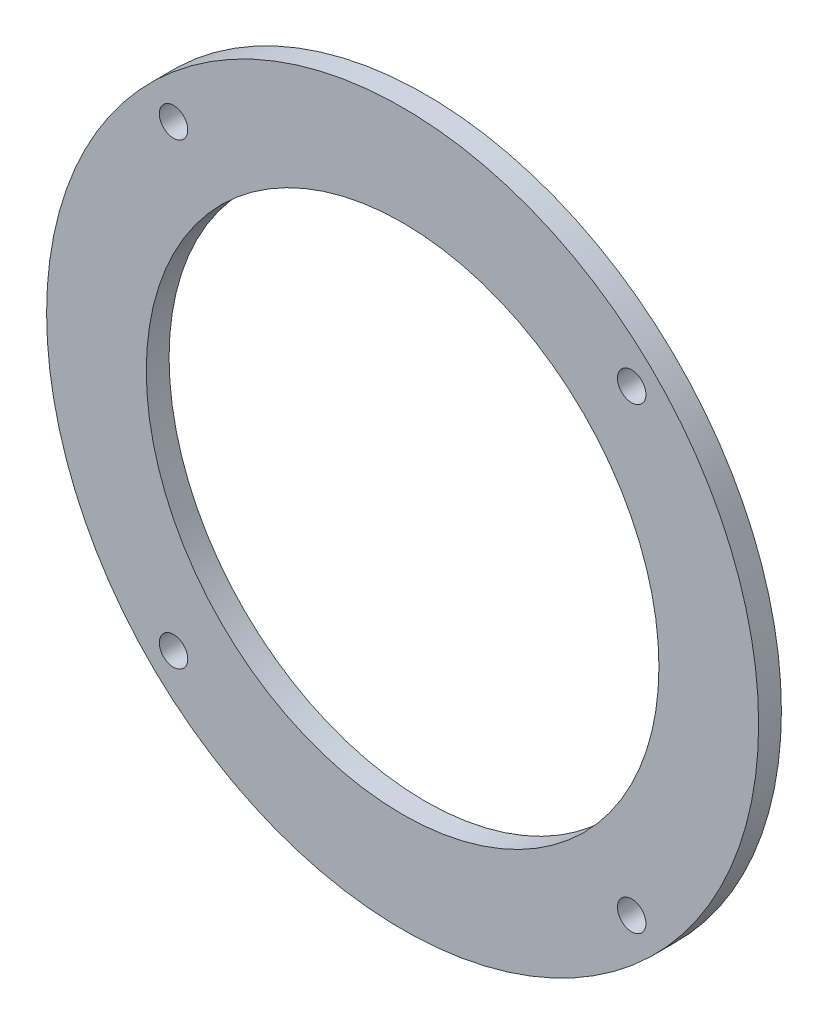
ISO-10303-21;
HEADER;
FILE_DESCRIPTION(('STEP AP214'),'2;1');
FILE_NAME('part.step','',(''),(''),'','','');
FILE_SCHEMA(('AUTOMOTIVE_DESIGN { 1 0 10303 214 1 1 1 1 }'));
ENDSEC;
DATA;
#1=APPLICATION_CONTEXT('core data for automotive mechanical design processes');
#2=APPLICATION_PROTOCOL_DEFINITION('international standard','automotive_design',2000,#1);
#3=PRODUCT_CONTEXT('',#1,'mechanical');
#4=PRODUCT('Part','Part','',(#3));
#5=PRODUCT_RELATED_PRODUCT_CATEGORY('part','',(#4));
#6=PRODUCT_DEFINITION_FORMATION('','',#4);
#7=PRODUCT_DEFINITION_CONTEXT('part definition',#1,'design');
#8=PRODUCT_DEFINITION('design','',#6,#7);
#9=PRODUCT_DEFINITION_SHAPE('','',#8);
#10=(LENGTH_UNIT() NAMED_UNIT(*) SI_UNIT(.MILLI.,.METRE.));
#11=(NAMED_UNIT(*) PLANE_ANGLE_UNIT() SI_UNIT($,.RADIAN.));
#12=(NAMED_UNIT(*) SI_UNIT($,.STERADIAN.) SOLID_ANGLE_UNIT());
#13=UNCERTAINTY_MEASURE_WITH_UNIT(LENGTH_MEASURE(1.E-05),#10,'distance_accuracy_value','');
#14=(GEOMETRIC_REPRESENTATION_CONTEXT(3) GLOBAL_UNCERTAINTY_ASSIGNED_CONTEXT((#13)) GLOBAL_UNIT_ASSIGNED_CONTEXT((#10,
#11,#12)) REPRESENTATION_CONTEXT('',''));
#15=CARTESIAN_POINT('',(0.,0.,0.));
#16=DIRECTION('',(0.,0.,1.));
#17=DIRECTION('',(1.,0.,0.));
#18=AXIS2_PLACEMENT_3D('',#15,#16,#17);
#19=CARTESIAN_POINT('',(0.,0.,1.6));
#20=DIRECTION('',(0.,0.,1.));
#21=DIRECTION('',(1.,0.,0.));
#22=AXIS2_PLACEMENT_3D('',#19,#20,#21);
#23=PLANE('',#22);
#24=CARTESIAN_POINT('',(-16.086679271994,16.086679271994,1.6));
#25=DIRECTION('',(0.,0.,1.));
#26=DIRECTION('',(1.,0.,0.));
#27=AXIS2_PLACEMENT_3D('',#24,#25,#26);
#28=CIRCLE('',#27,0.999999999999998);
#29=CARTESIAN_POINT('',(-15.086679271994,16.086679271994,1.6));
#30=VERTEX_POINT('',#29);
#31=EDGE_CURVE('E345',#30,#30,#28,.T.);
#32=ORIENTED_EDGE('',*,*,#31,.F.);
#33=EDGE_LOOP('',(#32));
#34=FACE_BOUND('',#33,.T.);
#35=CARTESIAN_POINT('',(-16.086679271994,-16.086679271994,1.6));
#36=DIRECTION('',(0.,0.,1.));
#37=DIRECTION('',(1.,0.,0.));
#38=AXIS2_PLACEMENT_3D('',#35,#36,#37);
#39=CIRCLE('',#38,0.999999999999998);
#40=CARTESIAN_POINT('',(-15.086679271994,-16.086679271994,1.6));
#41=VERTEX_POINT('',#40);
#42=EDGE_CURVE('E357',#41,#41,#39,.T.);
#43=ORIENTED_EDGE('',*,*,#42,.F.);
#44=EDGE_LOOP('',(#43));
#45=FACE_BOUND('',#44,.T.);
#46=CARTESIAN_POINT('',(0.,0.,1.6));
#47=DIRECTION('',(0.,0.,1.));
#48=DIRECTION('',(1.,0.,0.));
#49=AXIS2_PLACEMENT_3D('',#46,#47,#48);
#50=CIRCLE('',#49,25.);
#51=CARTESIAN_POINT('',(25.,0.,1.6));
#52=VERTEX_POINT('',#51);
#53=EDGE_CURVE('E12',#52,#52,#50,.T.);
#54=ORIENTED_EDGE('',*,*,#53,.T.);
#55=EDGE_LOOP('',(#54));
#56=FACE_BOUND('',#55,.T.);
#57=CARTESIAN_POINT('',(16.086679271994,-16.086679271994,1.6));
#58=DIRECTION('',(0.,0.,1.));
#59=DIRECTION('',(1.,0.,0.));
#60=AXIS2_PLACEMENT_3D('',#57,#58,#59);
#61=CIRCLE('',#60,0.999999999999998);
#62=CARTESIAN_POINT('',(17.086679271994,-16.086679271994,1.6));
#63=VERTEX_POINT('',#62);
#64=EDGE_CURVE('E363',#63,#63,#61,.T.);
#65=ORIENTED_EDGE('',*,*,#64,.F.);
#66=EDGE_LOOP('',(#65));
#67=FACE_BOUND('',#66,.T.);
#68=CARTESIAN_POINT('',(0.,0.,1.6));
#69=DIRECTION('',(0.,0.,1.));
#70=DIRECTION('',(1.,0.,0.));
#71=AXIS2_PLACEMENT_3D('',#68,#69,#70);
#72=CIRCLE('',#71,18.);
#73=CARTESIAN_POINT('',(18.,0.,1.6));
#74=VERTEX_POINT('',#73);
#75=EDGE_CURVE('E351',#74,#74,#72,.T.);
#76=ORIENTED_EDGE('',*,*,#75,.F.);
#77=EDGE_LOOP('',(#76));
#78=FACE_BOUND('',#77,.T.);
#79=CARTESIAN_POINT('',(16.086679271994,16.086679271994,1.6));
#80=DIRECTION('',(0.,0.,1.));
#81=DIRECTION('',(1.,0.,0.));
#82=AXIS2_PLACEMENT_3D('',#79,#80,#81);
#83=CIRCLE('',#82,0.999999999999998);
#84=CARTESIAN_POINT('',(17.086679271994,16.086679271994,1.6));
#85=VERTEX_POINT('',#84);
#86=EDGE_CURVE('E339',#85,#85,#83,.T.);
#87=ORIENTED_EDGE('',*,*,#86,.F.);
#88=EDGE_LOOP('',(#87));
#89=FACE_BOUND('',#88,.T.);
#90=ADVANCED_FACE('F89',(#34,#45,#56,#67,#78,#89),#23,.T.);
#91=CARTESIAN_POINT('',(0.,0.,0.));
#92=DIRECTION('',(0.,0.,1.));
#93=DIRECTION('',(1.,0.,0.));
#94=AXIS2_PLACEMENT_3D('',#91,#92,#93);
#95=PLANE('',#94);
#96=DIRECTION('',(-1.,0.,0.));
#97=VECTOR('',#96,1.);
#98=CARTESIAN_POINT('',(0.700000000000007,23.8,0.));
#99=LINE('',#98,#97);
#100=CARTESIAN_POINT('',(1.9,23.8,0.));
#101=VERTEX_POINT('',#100);
#102=CARTESIAN_POINT('',(0.700000000000007,23.8,0.));
#103=VERTEX_POINT('',#102);
#104=EDGE_CURVE('E227',#101,#103,#99,.T.);
#105=ORIENTED_EDGE('',*,*,#104,.T.);
#106=DIRECTION('',(0.,-1.,0.));
#107=VECTOR('',#106,1.);
#108=CARTESIAN_POINT('',(0.700000000000007,23.8,0.));
#109=LINE('',#108,#107);
#110=CARTESIAN_POINT('',(0.700000000000007,21.5,0.));
#111=VERTEX_POINT('',#110);
#112=EDGE_CURVE('E234',#103,#111,#109,.T.);
#113=ORIENTED_EDGE('',*,*,#112,.T.);
#114=DIRECTION('',(1.,0.,0.));
#115=VECTOR('',#114,1.);
#116=CARTESIAN_POINT('',(0.700000000000007,21.5,0.));
#117=LINE('',#116,#115);
#118=CARTESIAN_POINT('',(1.9,21.5,0.));
#119=VERTEX_POINT('',#118);
#120=EDGE_CURVE('E207',#111,#119,#117,.T.);
#121=ORIENTED_EDGE('',*,*,#120,.T.);
#122=DIRECTION('',(0.,1.,0.));
#123=VECTOR('',#122,1.);
#124=CARTESIAN_POINT('',(1.9,23.8,0.));
#125=LINE('',#124,#123);
#126=EDGE_CURVE('E104',#119,#101,#125,.T.);
#127=ORIENTED_EDGE('',*,*,#126,.T.);
#128=EDGE_LOOP('',(#105,#113,#121,#127));
#129=FACE_BOUND('',#128,.T.);
#130=DIRECTION('',(1.,0.,0.));
#131=VECTOR('',#130,1.);
#132=CARTESIAN_POINT('',(3.30000000000001,21.5,0.));
#133=LINE('',#132,#131);
#134=CARTESIAN_POINT('',(3.30000000000001,21.5,0.));
#135=VERTEX_POINT('',#134);
#136=CARTESIAN_POINT('',(4.49999999999995,21.5,0.));
#137=VERTEX_POINT('',#136);
#138=EDGE_CURVE('E247',#135,#137,#133,.T.);
#139=ORIENTED_EDGE('',*,*,#138,.T.);
#140=DIRECTION('',(0.,1.,0.));
#141=VECTOR('',#140,1.);
#142=CARTESIAN_POINT('',(4.49999999999995,23.8,0.));
#143=LINE('',#142,#141);
#144=CARTESIAN_POINT('',(4.49999999999995,23.8,0.));
#145=VERTEX_POINT('',#144);
#146=EDGE_CURVE('E239',#137,#145,#143,.T.);
#147=ORIENTED_EDGE('',*,*,#146,.T.);
#148=DIRECTION('',(-1.,0.,0.));
#149=VECTOR('',#148,1.);
#150=CARTESIAN_POINT('',(3.30000000000001,23.8,0.));
#151=LINE('',#150,#149);
#152=CARTESIAN_POINT('',(3.30000000000001,23.8,0.));
#153=VERTEX_POINT('',#152);
#154=EDGE_CURVE('E259',#145,#153,#151,.T.);
#155=ORIENTED_EDGE('',*,*,#154,.T.);
#156=DIRECTION('',(0.,-1.,0.));
#157=VECTOR('',#156,1.);
#158=CARTESIAN_POINT('',(3.30000000000001,23.8,0.));
#159=LINE('',#158,#157);
#160=EDGE_CURVE('E112',#153,#135,#159,.T.);
#161=ORIENTED_EDGE('',*,*,#160,.T.);
#162=EDGE_LOOP('',(#139,#147,#155,#161));
#163=FACE_BOUND('',#162,.T.);
#164=DIRECTION('',(0.,1.,0.));
#165=VECTOR('',#164,1.);
#166=CARTESIAN_POINT('',(-3.29999999999999,23.8,0.));
#167=LINE('',#166,#165);
#168=CARTESIAN_POINT('',(-3.29999999999999,21.5,0.));
#169=VERTEX_POINT('',#168);
#170=CARTESIAN_POINT('',(-3.29999999999999,23.8,0.));
#171=VERTEX_POINT('',#170);
#172=EDGE_CURVE('E277',#169,#171,#167,.T.);
#173=ORIENTED_EDGE('',*,*,#172,.T.);
#174=DIRECTION('',(-1.,0.,0.));
#175=VECTOR('',#174,1.);
#176=CARTESIAN_POINT('',(-3.29999999999999,23.8,0.));
#177=LINE('',#176,#175);
#178=CARTESIAN_POINT('',(-4.49999999999994,23.8,0.));
#179=VERTEX_POINT('',#178);
#180=EDGE_CURVE('E267',#171,#179,#177,.T.);
#181=ORIENTED_EDGE('',*,*,#180,.T.);
#182=DIRECTION('',(0.,-1.,0.));
#183=VECTOR('',#182,1.);
#184=CARTESIAN_POINT('',(-4.49999999999994,23.8,0.));
#185=LINE('',#184,#183);
#186=CARTESIAN_POINT('',(-4.49999999999994,21.5,0.));
#187=VERTEX_POINT('',#186);
#188=EDGE_CURVE('E289',#179,#187,#185,.T.);
#189=ORIENTED_EDGE('',*,*,#188,.T.);
#190=DIRECTION('',(1.,0.,0.));
#191=VECTOR('',#190,1.);
#192=CARTESIAN_POINT('',(-3.29999999999999,21.5,0.));
#193=LINE('',#192,#191);
#194=EDGE_CURVE('E292',#187,#169,#193,.T.);
#195=ORIENTED_EDGE('',*,*,#194,.T.);
#196=EDGE_LOOP('',(#173,#181,#189,#195));
#197=FACE_BOUND('',#196,.T.);
#198=DIRECTION('',(0.,1.,0.));
#199=VECTOR('',#198,1.);
#200=CARTESIAN_POINT('',(-0.699999999999995,23.8,0.));
#201=LINE('',#200,#199);
#202=CARTESIAN_POINT('',(-0.699999999999996,21.5,0.));
#203=VERTEX_POINT('',#202);
#204=CARTESIAN_POINT('',(-0.699999999999995,23.8,0.));
#205=VERTEX_POINT('',#204);
#206=EDGE_CURVE('E310',#203,#205,#201,.T.);
#207=ORIENTED_EDGE('',*,*,#206,.T.);
#208=DIRECTION('',(-1.,0.,0.));
#209=VECTOR('',#208,1.);
#210=CARTESIAN_POINT('',(-0.699999999999995,23.8,0.));
#211=LINE('',#210,#209);
#212=CARTESIAN_POINT('',(-1.89999999999999,23.8,0.));
#213=VERTEX_POINT('',#212);
#214=EDGE_CURVE('E299',#205,#213,#211,.T.);
#215=ORIENTED_EDGE('',*,*,#214,.T.);
#216=DIRECTION('',(0.,-1.,0.));
#217=VECTOR('',#216,1.);
#218=CARTESIAN_POINT('',(-1.89999999999999,23.8,0.));
#219=LINE('',#218,#217);
#220=CARTESIAN_POINT('',(-1.89999999999999,21.5,0.));
#221=VERTEX_POINT('',#220);
#222=EDGE_CURVE('E322',#213,#221,#219,.T.);
#223=ORIENTED_EDGE('',*,*,#222,.T.);
#224=DIRECTION('',(1.,0.,0.));
#225=VECTOR('',#224,1.);
#226=CARTESIAN_POINT('',(-0.699999999999996,21.5,0.));
#227=LINE('',#226,#225);
#228=EDGE_CURVE('E325',#221,#203,#227,.T.);
#229=ORIENTED_EDGE('',*,*,#228,.T.);
#230=EDGE_LOOP('',(#207,#215,#223,#229));
#231=FACE_BOUND('',#230,.T.);
#232=CARTESIAN_POINT('',(0.,0.,0.));
#233=DIRECTION('',(0.,0.,1.));
#234=DIRECTION('',(1.,0.,0.));
#235=AXIS2_PLACEMENT_3D('',#232,#233,#234);
#236=CIRCLE('',#235,25.);
#237=CARTESIAN_POINT('',(25.,0.,0.));
#238=VERTEX_POINT('',#237);
#239=EDGE_CURVE('E93',#238,#238,#236,.T.);
#240=ORIENTED_EDGE('',*,*,#239,.F.);
#241=EDGE_LOOP('',(#240));
#242=FACE_BOUND('',#241,.T.);
#243=CARTESIAN_POINT('',(16.086679271994,-16.086679271994,0.));
#244=DIRECTION('',(0.,0.,1.));
#245=DIRECTION('',(1.,0.,0.));
#246=AXIS2_PLACEMENT_3D('',#243,#244,#245);
#247=CIRCLE('',#246,0.999999999999998);
#248=CARTESIAN_POINT('',(17.086679271994,-16.086679271994,0.));
#249=VERTEX_POINT('',#248);
#250=EDGE_CURVE('E360',#249,#249,#247,.T.);
#251=ORIENTED_EDGE('',*,*,#250,.T.);
#252=EDGE_LOOP('',(#251));
#253=FACE_BOUND('',#252,.T.);
#254=CARTESIAN_POINT('',(-16.086679271994,-16.086679271994,0.));
#255=DIRECTION('',(0.,0.,1.));
#256=DIRECTION('',(1.,0.,0.));
#257=AXIS2_PLACEMENT_3D('',#254,#255,#256);
#258=CIRCLE('',#257,0.999999999999998);
#259=CARTESIAN_POINT('',(-15.086679271994,-16.086679271994,0.));
#260=VERTEX_POINT('',#259);
#261=EDGE_CURVE('E354',#260,#260,#258,.T.);
#262=ORIENTED_EDGE('',*,*,#261,.T.);
#263=EDGE_LOOP('',(#262));
#264=FACE_BOUND('',#263,.T.);
#265=CARTESIAN_POINT('',(0.,0.,0.));
#266=DIRECTION('',(0.,0.,1.));
#267=DIRECTION('',(1.,0.,0.));
#268=AXIS2_PLACEMENT_3D('',#265,#266,#267);
#269=CIRCLE('',#268,18.);
#270=CARTESIAN_POINT('',(18.,0.,0.));
#271=VERTEX_POINT('',#270);
#272=EDGE_CURVE('E348',#271,#271,#269,.T.);
#273=ORIENTED_EDGE('',*,*,#272,.T.);
#274=EDGE_LOOP('',(#273));
#275=FACE_BOUND('',#274,.T.);
#276=CARTESIAN_POINT('',(-16.086679271994,16.086679271994,0.));
#277=DIRECTION('',(0.,0.,1.));
#278=DIRECTION('',(1.,0.,0.));
#279=AXIS2_PLACEMENT_3D('',#276,#277,#278);
#280=CIRCLE('',#279,0.999999999999998);
#281=CARTESIAN_POINT('',(-15.086679271994,16.086679271994,0.));
#282=VERTEX_POINT('',#281);
#283=EDGE_CURVE('E342',#282,#282,#280,.T.);
#284=ORIENTED_EDGE('',*,*,#283,.T.);
#285=EDGE_LOOP('',(#284));
#286=FACE_BOUND('',#285,.T.);
#287=CARTESIAN_POINT('',(16.086679271994,16.086679271994,0.));
#288=DIRECTION('',(0.,0.,1.));
#289=DIRECTION('',(1.,0.,0.));
#290=AXIS2_PLACEMENT_3D('',#287,#288,#289);
#291=CIRCLE('',#290,0.999999999999998);
#292=CARTESIAN_POINT('',(17.086679271994,16.086679271994,0.));
#293=VERTEX_POINT('',#292);
#294=EDGE_CURVE('E332',#293,#293,#291,.T.);
#295=ORIENTED_EDGE('',*,*,#294,.T.);
#296=EDGE_LOOP('',(#295));
#297=FACE_BOUND('',#296,.T.);
#298=ADVANCED_FACE('F369',(#129,#163,#197,#231,#242,#253,#264,#275,#286,#297),#95,.F.);
#299=CARTESIAN_POINT('',(0.,0.,1.6));
#300=DIRECTION('',(0.,0.,-1.));
#301=DIRECTION('',(-1.,0.,0.));
#302=AXIS2_PLACEMENT_3D('',#299,#300,#301);
#303=CYLINDRICAL_SURFACE('',#302,25.);
#304=ORIENTED_EDGE('',*,*,#53,.F.);
#305=EDGE_LOOP('',(#304));
#306=FACE_BOUND('',#305,.T.);
#307=ORIENTED_EDGE('',*,*,#239,.T.);
#308=EDGE_LOOP('',(#307));
#309=FACE_BOUND('',#308,.T.);
#310=ADVANCED_FACE('F91',(#306,#309),#303,.T.);
#311=CARTESIAN_POINT('',(16.086679271994,-16.086679271994,1.6));
#312=DIRECTION('',(0.,0.,-1.));
#313=DIRECTION('',(-1.,0.,0.));
#314=AXIS2_PLACEMENT_3D('',#311,#312,#313);
#315=CYLINDRICAL_SURFACE('',#314,0.999999999999998);
#316=ORIENTED_EDGE('',*,*,#64,.T.);
#317=EDGE_LOOP('',(#316));
#318=FACE_BOUND('',#317,.T.);
#319=ORIENTED_EDGE('',*,*,#250,.F.);
#320=EDGE_LOOP('',(#319));
#321=FACE_BOUND('',#320,.T.);
#322=ADVANCED_FACE('F372',(#318,#321),#315,.F.);
#323=CARTESIAN_POINT('',(-16.086679271994,-16.086679271994,1.6));
#324=DIRECTION('',(0.,0.,-1.));
#325=DIRECTION('',(-1.,0.,0.));
#326=AXIS2_PLACEMENT_3D('',#323,#324,#325);
#327=CYLINDRICAL_SURFACE('',#326,0.999999999999998);
#328=ORIENTED_EDGE('',*,*,#42,.T.);
#329=EDGE_LOOP('',(#328));
#330=FACE_BOUND('',#329,.T.);
#331=ORIENTED_EDGE('',*,*,#261,.F.);
#332=EDGE_LOOP('',(#331));
#333=FACE_BOUND('',#332,.T.);
#334=ADVANCED_FACE('F374',(#330,#333),#327,.F.);
#335=CARTESIAN_POINT('',(0.,0.,1.6));
#336=DIRECTION('',(0.,0.,-1.));
#337=DIRECTION('',(-1.,0.,0.));
#338=AXIS2_PLACEMENT_3D('',#335,#336,#337);
#339=CYLINDRICAL_SURFACE('',#338,18.);
#340=ORIENTED_EDGE('',*,*,#75,.T.);
#341=EDGE_LOOP('',(#340));
#342=FACE_BOUND('',#341,.T.);
#343=ORIENTED_EDGE('',*,*,#272,.F.);
#344=EDGE_LOOP('',(#343));
#345=FACE_BOUND('',#344,.T.);
#346=ADVANCED_FACE('F381',(#342,#345),#339,.F.);
#347=CARTESIAN_POINT('',(-16.086679271994,16.086679271994,1.6));
#348=DIRECTION('',(0.,0.,-1.));
#349=DIRECTION('',(-1.,0.,0.));
#350=AXIS2_PLACEMENT_3D('',#347,#348,#349);
#351=CYLINDRICAL_SURFACE('',#350,0.999999999999998);
#352=ORIENTED_EDGE('',*,*,#31,.T.);
#353=EDGE_LOOP('',(#352));
#354=FACE_BOUND('',#353,.T.);
#355=ORIENTED_EDGE('',*,*,#283,.F.);
#356=EDGE_LOOP('',(#355));
#357=FACE_BOUND('',#356,.T.);
#358=ADVANCED_FACE('F408',(#354,#357),#351,.F.);
#359=CARTESIAN_POINT('',(16.086679271994,16.086679271994,1.6));
#360=DIRECTION('',(0.,0.,-1.));
#361=DIRECTION('',(-1.,0.,0.));
#362=AXIS2_PLACEMENT_3D('',#359,#360,#361);
#363=CYLINDRICAL_SURFACE('',#362,0.999999999999998);
#364=ORIENTED_EDGE('',*,*,#86,.T.);
#365=EDGE_LOOP('',(#364));
#366=FACE_BOUND('',#365,.T.);
#367=ORIENTED_EDGE('',*,*,#294,.F.);
#368=EDGE_LOOP('',(#367));
#369=FACE_BOUND('',#368,.T.);
#370=ADVANCED_FACE('F404',(#366,#369),#363,.F.);
#371=CARTESIAN_POINT('',(-0.699999999999995,23.8,-0.1));
#372=DIRECTION('',(0.,1.,0.));
#373=DIRECTION('',(0.,0.,1.));
#374=AXIS2_PLACEMENT_3D('',#371,#372,#373);
#375=PLANE('',#374);
#376=ORIENTED_EDGE('',*,*,#214,.F.);
#377=DIRECTION('',(0.,0.,1.));
#378=VECTOR('',#377,1.);
#379=CARTESIAN_POINT('',(-0.699999999999995,23.8,-0.1));
#380=LINE('',#379,#378);
#381=CARTESIAN_POINT('',(-0.699999999999995,23.8,-0.1));
#382=VERTEX_POINT('',#381);
#383=EDGE_CURVE('E330',#382,#205,#380,.T.);
#384=ORIENTED_EDGE('',*,*,#383,.F.);
#385=DIRECTION('',(-1.,0.,0.));
#386=VECTOR('',#385,1.);
#387=CARTESIAN_POINT('',(-0.699999999999995,23.8,-0.1));
#388=LINE('',#387,#386);
#389=CARTESIAN_POINT('',(-1.89999999999999,23.8,-0.1));
#390=VERTEX_POINT('',#389);
#391=EDGE_CURVE('E306',#382,#390,#388,.T.);
#392=ORIENTED_EDGE('',*,*,#391,.T.);
#393=DIRECTION('',(0.,0.,1.));
#394=VECTOR('',#393,1.);
#395=CARTESIAN_POINT('',(-1.89999999999999,23.8,-0.1));
#396=LINE('',#395,#394);
#397=EDGE_CURVE('E319',#390,#213,#396,.T.);
#398=ORIENTED_EDGE('',*,*,#397,.T.);
#399=EDGE_LOOP('',(#376,#384,#392,#398));
#400=FACE_BOUND('',#399,.T.);
#401=ADVANCED_FACE('F407',(#400),#375,.T.);
#402=CARTESIAN_POINT('',(-0.699999999999995,23.8,-0.1));
#403=DIRECTION('',(1.,0.,0.));
#404=DIRECTION('',(0.,1.,0.));
#405=AXIS2_PLACEMENT_3D('',#402,#403,#404);
#406=PLANE('',#405);
#407=ORIENTED_EDGE('',*,*,#206,.F.);
#408=DIRECTION('',(0.,0.,1.));
#409=VECTOR('',#408,1.);
#410=CARTESIAN_POINT('',(-0.699999999999996,21.5,-0.1));
#411=LINE('',#410,#409);
#412=CARTESIAN_POINT('',(-0.699999999999996,21.5,-0.1));
#413=VERTEX_POINT('',#412);
#414=EDGE_CURVE('E333',#413,#203,#411,.T.);
#415=ORIENTED_EDGE('',*,*,#414,.F.);
#416=DIRECTION('',(0.,1.,0.));
#417=VECTOR('',#416,1.);
#418=CARTESIAN_POINT('',(-0.699999999999995,23.8,-0.1));
#419=LINE('',#418,#417);
#420=EDGE_CURVE('E316',#413,#382,#419,.T.);
#421=ORIENTED_EDGE('',*,*,#420,.T.);
#422=ORIENTED_EDGE('',*,*,#383,.T.);
#423=EDGE_LOOP('',(#407,#415,#421,#422));
#424=FACE_BOUND('',#423,.T.);
#425=ADVANCED_FACE('F416',(#424),#406,.T.);
#426=CARTESIAN_POINT('',(-0.699999999999996,21.5,-0.1));
#427=DIRECTION('',(0.,-1.,0.));
#428=DIRECTION('',(0.,0.,-1.));
#429=AXIS2_PLACEMENT_3D('',#426,#427,#428);
#430=PLANE('',#429);
#431=ORIENTED_EDGE('',*,*,#228,.F.);
#432=DIRECTION('',(0.,0.,1.));
#433=VECTOR('',#432,1.);
#434=CARTESIAN_POINT('',(-1.89999999999999,21.5,-0.1));
#435=LINE('',#434,#433);
#436=CARTESIAN_POINT('',(-1.89999999999999,21.5,-0.1));
#437=VERTEX_POINT('',#436);
#438=EDGE_CURVE('E335',#437,#221,#435,.T.);
#439=ORIENTED_EDGE('',*,*,#438,.F.);
#440=DIRECTION('',(1.,0.,0.));
#441=VECTOR('',#440,1.);
#442=CARTESIAN_POINT('',(-0.699999999999996,21.5,-0.1));
#443=LINE('',#442,#441);
#444=EDGE_CURVE('E313',#437,#413,#443,.T.);
#445=ORIENTED_EDGE('',*,*,#444,.T.);
#446=ORIENTED_EDGE('',*,*,#414,.T.);
#447=EDGE_LOOP('',(#431,#439,#445,#446));
#448=FACE_BOUND('',#447,.T.);
#449=ADVANCED_FACE('F466',(#448),#430,.T.);
#450=CARTESIAN_POINT('',(-1.89999999999999,23.8,-0.1));
#451=DIRECTION('',(-1.,0.,0.));
#452=DIRECTION('',(0.,-1.,0.));
#453=AXIS2_PLACEMENT_3D('',#450,#451,#452);
#454=PLANE('',#453);
#455=ORIENTED_EDGE('',*,*,#222,.F.);
#456=ORIENTED_EDGE('',*,*,#397,.F.);
#457=DIRECTION('',(0.,-1.,0.));
#458=VECTOR('',#457,1.);
#459=CARTESIAN_POINT('',(-1.89999999999999,23.8,-0.1));
#460=LINE('',#459,#458);
#461=EDGE_CURVE('E309',#390,#437,#460,.T.);
#462=ORIENTED_EDGE('',*,*,#461,.T.);
#463=ORIENTED_EDGE('',*,*,#438,.T.);
#464=EDGE_LOOP('',(#455,#456,#462,#463));
#465=FACE_BOUND('',#464,.T.);
#466=ADVANCED_FACE('F476',(#465),#454,.T.);
#467=CARTESIAN_POINT('',(0.,0.,-0.1));
#468=DIRECTION('',(0.,0.,1.));
#469=DIRECTION('',(1.,0.,0.));
#470=AXIS2_PLACEMENT_3D('',#467,#468,#469);
#471=PLANE('',#470);
#472=ORIENTED_EDGE('',*,*,#391,.F.);
#473=ORIENTED_EDGE('',*,*,#420,.F.);
#474=ORIENTED_EDGE('',*,*,#444,.F.);
#475=ORIENTED_EDGE('',*,*,#461,.F.);
#476=EDGE_LOOP('',(#472,#473,#474,#475));
#477=FACE_BOUND('',#476,.T.);
#478=ADVANCED_FACE('F486',(#477),#471,.F.);
#479=CARTESIAN_POINT('',(-3.29999999999999,23.8,-0.1));
#480=DIRECTION('',(0.,1.,0.));
#481=DIRECTION('',(0.,0.,1.));
#482=AXIS2_PLACEMENT_3D('',#479,#480,#481);
#483=PLANE('',#482);
#484=ORIENTED_EDGE('',*,*,#180,.F.);
#485=DIRECTION('',(0.,0.,1.));
#486=VECTOR('',#485,1.);
#487=CARTESIAN_POINT('',(-3.29999999999999,23.8,-0.1));
#488=LINE('',#487,#486);
#489=CARTESIAN_POINT('',(-3.29999999999999,23.8,-0.1));
#490=VERTEX_POINT('',#489);
#491=EDGE_CURVE('E297',#490,#171,#488,.T.);
#492=ORIENTED_EDGE('',*,*,#491,.F.);
#493=DIRECTION('',(-1.,0.,0.));
#494=VECTOR('',#493,1.);
#495=CARTESIAN_POINT('',(-3.29999999999999,23.8,-0.1));
#496=LINE('',#495,#494);
#497=CARTESIAN_POINT('',(-4.49999999999994,23.8,-0.1));
#498=VERTEX_POINT('',#497);
#499=EDGE_CURVE('E273',#490,#498,#496,.T.);
#500=ORIENTED_EDGE('',*,*,#499,.T.);
#501=DIRECTION('',(0.,0.,1.));
#502=VECTOR('',#501,1.);
#503=CARTESIAN_POINT('',(-4.49999999999994,23.8,-0.1));
#504=LINE('',#503,#502);
#505=EDGE_CURVE('E286',#498,#179,#504,.T.);
#506=ORIENTED_EDGE('',*,*,#505,.T.);
#507=EDGE_LOOP('',(#484,#492,#500,#506));
#508=FACE_BOUND('',#507,.T.);
#509=ADVANCED_FACE('F496',(#508),#483,.T.);
#510=CARTESIAN_POINT('',(-3.29999999999999,23.8,-0.1));
#511=DIRECTION('',(1.,0.,0.));
#512=DIRECTION('',(0.,1.,0.));
#513=AXIS2_PLACEMENT_3D('',#510,#511,#512);
#514=PLANE('',#513);
#515=ORIENTED_EDGE('',*,*,#172,.F.);
#516=DIRECTION('',(0.,0.,1.));
#517=VECTOR('',#516,1.);
#518=CARTESIAN_POINT('',(-3.29999999999999,21.5,-0.1));
#519=LINE('',#518,#517);
#520=CARTESIAN_POINT('',(-3.29999999999999,21.5,-0.1));
#521=VERTEX_POINT('',#520);
#522=EDGE_CURVE('E300',#521,#169,#519,.T.);
#523=ORIENTED_EDGE('',*,*,#522,.F.);
#524=DIRECTION('',(0.,1.,0.));
#525=VECTOR('',#524,1.);
#526=CARTESIAN_POINT('',(-3.29999999999999,23.8,-0.1));
#527=LINE('',#526,#525);
#528=EDGE_CURVE('E283',#521,#490,#527,.T.);
#529=ORIENTED_EDGE('',*,*,#528,.T.);
#530=ORIENTED_EDGE('',*,*,#491,.T.);
#531=EDGE_LOOP('',(#515,#523,#529,#530));
#532=FACE_BOUND('',#531,.T.);
#533=ADVANCED_FACE('F508',(#532),#514,.T.);
#534=CARTESIAN_POINT('',(-3.29999999999999,21.5,-0.1));
#535=DIRECTION('',(0.,-1.,0.));
#536=DIRECTION('',(0.,0.,-1.));
#537=AXIS2_PLACEMENT_3D('',#534,#535,#536);
#538=PLANE('',#537);
#539=ORIENTED_EDGE('',*,*,#194,.F.);
#540=DIRECTION('',(0.,0.,1.));
#541=VECTOR('',#540,1.);
#542=CARTESIAN_POINT('',(-4.49999999999994,21.5,-0.1));
#543=LINE('',#542,#541);
#544=CARTESIAN_POINT('',(-4.49999999999994,21.5,-0.1));
#545=VERTEX_POINT('',#544);
#546=EDGE_CURVE('E302',#545,#187,#543,.T.);
#547=ORIENTED_EDGE('',*,*,#546,.F.);
#548=DIRECTION('',(1.,0.,0.));
#549=VECTOR('',#548,1.);
#550=CARTESIAN_POINT('',(-3.29999999999999,21.5,-0.1));
#551=LINE('',#550,#549);
#552=EDGE_CURVE('E280',#545,#521,#551,.T.);
#553=ORIENTED_EDGE('',*,*,#552,.T.);
#554=ORIENTED_EDGE('',*,*,#522,.T.);
#555=EDGE_LOOP('',(#539,#547,#553,#554));
#556=FACE_BOUND('',#555,.T.);
#557=ADVANCED_FACE('F518',(#556),#538,.T.);
#558=CARTESIAN_POINT('',(-4.49999999999994,23.8,-0.1));
#559=DIRECTION('',(-1.,0.,0.));
#560=DIRECTION('',(0.,0.,1.));
#561=AXIS2_PLACEMENT_3D('',#558,#559,#560);
#562=PLANE('',#561);
#563=ORIENTED_EDGE('',*,*,#188,.F.);
#564=ORIENTED_EDGE('',*,*,#505,.F.);
#565=DIRECTION('',(0.,-1.,0.));
#566=VECTOR('',#565,1.);
#567=CARTESIAN_POINT('',(-4.49999999999994,23.8,-0.1));
#568=LINE('',#567,#566);
#569=EDGE_CURVE('E276',#498,#545,#568,.T.);
#570=ORIENTED_EDGE('',*,*,#569,.T.);
#571=ORIENTED_EDGE('',*,*,#546,.T.);
#572=EDGE_LOOP('',(#563,#564,#570,#571));
#573=FACE_BOUND('',#572,.T.);
#574=ADVANCED_FACE('F528',(#573),#562,.T.);
#575=CARTESIAN_POINT('',(0.,0.,-0.1));
#576=DIRECTION('',(0.,0.,1.));
#577=DIRECTION('',(1.,0.,0.));
#578=AXIS2_PLACEMENT_3D('',#575,#576,#577);
#579=PLANE('',#578);
#580=ORIENTED_EDGE('',*,*,#499,.F.);
#581=ORIENTED_EDGE('',*,*,#528,.F.);
#582=ORIENTED_EDGE('',*,*,#552,.F.);
#583=ORIENTED_EDGE('',*,*,#569,.F.);
#584=EDGE_LOOP('',(#580,#581,#582,#583));
#585=FACE_BOUND('',#584,.T.);
#586=ADVANCED_FACE('F538',(#585),#579,.F.);
#587=CARTESIAN_POINT('',(4.49999999999995,23.8,-0.1));
#588=DIRECTION('',(1.,0.,0.));
#589=DIRECTION('',(0.,0.,-1.));
#590=AXIS2_PLACEMENT_3D('',#587,#588,#589);
#591=PLANE('',#590);
#592=ORIENTED_EDGE('',*,*,#146,.F.);
#593=DIRECTION('',(0.,0.,1.));
#594=VECTOR('',#593,1.);
#595=CARTESIAN_POINT('',(4.49999999999995,21.5,-0.1));
#596=LINE('',#595,#594);
#597=CARTESIAN_POINT('',(4.49999999999995,21.5,-0.1));
#598=VERTEX_POINT('',#597);
#599=EDGE_CURVE('E265',#598,#137,#596,.T.);
#600=ORIENTED_EDGE('',*,*,#599,.F.);
#601=DIRECTION('',(0.,1.,0.));
#602=VECTOR('',#601,1.);
#603=CARTESIAN_POINT('',(4.49999999999995,23.8,-0.1));
#604=LINE('',#603,#602);
#605=CARTESIAN_POINT('',(4.49999999999995,23.8,-0.1));
#606=VERTEX_POINT('',#605);
#607=EDGE_CURVE('E243',#598,#606,#604,.T.);
#608=ORIENTED_EDGE('',*,*,#607,.T.);
#609=DIRECTION('',(0.,0.,1.));
#610=VECTOR('',#609,1.);
#611=CARTESIAN_POINT('',(4.49999999999995,23.8,-0.1));
#612=LINE('',#611,#610);
#613=EDGE_CURVE('E256',#606,#145,#612,.T.);
#614=ORIENTED_EDGE('',*,*,#613,.T.);
#615=EDGE_LOOP('',(#592,#600,#608,#614));
#616=FACE_BOUND('',#615,.T.);
#617=ADVANCED_FACE('F548',(#616),#591,.T.);
#618=CARTESIAN_POINT('',(3.30000000000001,21.5,-0.1));
#619=DIRECTION('',(0.,-1.,0.));
#620=DIRECTION('',(0.,0.,-1.));
#621=AXIS2_PLACEMENT_3D('',#618,#619,#620);
#622=PLANE('',#621);
#623=ORIENTED_EDGE('',*,*,#138,.F.);
#624=DIRECTION('',(0.,0.,1.));
#625=VECTOR('',#624,1.);
#626=CARTESIAN_POINT('',(3.30000000000001,21.5,-0.1));
#627=LINE('',#626,#625);
#628=CARTESIAN_POINT('',(3.30000000000001,21.5,-0.1));
#629=VERTEX_POINT('',#628);
#630=EDGE_CURVE('E268',#629,#135,#627,.T.);
#631=ORIENTED_EDGE('',*,*,#630,.F.);
#632=DIRECTION('',(1.,0.,0.));
#633=VECTOR('',#632,1.);
#634=CARTESIAN_POINT('',(3.30000000000001,21.5,-0.1));
#635=LINE('',#634,#633);
#636=EDGE_CURVE('E253',#629,#598,#635,.T.);
#637=ORIENTED_EDGE('',*,*,#636,.T.);
#638=ORIENTED_EDGE('',*,*,#599,.T.);
#639=EDGE_LOOP('',(#623,#631,#637,#638));
#640=FACE_BOUND('',#639,.T.);
#641=ADVANCED_FACE('F558',(#640),#622,.T.);
#642=CARTESIAN_POINT('',(3.30000000000001,23.8,-0.1));
#643=DIRECTION('',(-1.,0.,0.));
#644=DIRECTION('',(0.,0.,1.));
#645=AXIS2_PLACEMENT_3D('',#642,#643,#644);
#646=PLANE('',#645);
#647=ORIENTED_EDGE('',*,*,#160,.F.);
#648=DIRECTION('',(0.,0.,1.));
#649=VECTOR('',#648,1.);
#650=CARTESIAN_POINT('',(3.30000000000001,23.8,-0.1));
#651=LINE('',#650,#649);
#652=CARTESIAN_POINT('',(3.30000000000001,23.8,-0.1));
#653=VERTEX_POINT('',#652);
#654=EDGE_CURVE('E270',#653,#153,#651,.T.);
#655=ORIENTED_EDGE('',*,*,#654,.F.);
#656=DIRECTION('',(0.,-1.,0.));
#657=VECTOR('',#656,1.);
#658=CARTESIAN_POINT('',(3.30000000000001,23.8,-0.1));
#659=LINE('',#658,#657);
#660=EDGE_CURVE('E250',#653,#629,#659,.T.);
#661=ORIENTED_EDGE('',*,*,#660,.T.);
#662=ORIENTED_EDGE('',*,*,#630,.T.);
#663=EDGE_LOOP('',(#647,#655,#661,#662));
#664=FACE_BOUND('',#663,.T.);
#665=ADVANCED_FACE('F568',(#664),#646,.T.);
#666=CARTESIAN_POINT('',(3.30000000000001,23.8,-0.1));
#667=DIRECTION('',(0.,1.,0.));
#668=DIRECTION('',(0.,0.,1.));
#669=AXIS2_PLACEMENT_3D('',#666,#667,#668);
#670=PLANE('',#669);
#671=ORIENTED_EDGE('',*,*,#154,.F.);
#672=ORIENTED_EDGE('',*,*,#613,.F.);
#673=DIRECTION('',(-1.,0.,0.));
#674=VECTOR('',#673,1.);
#675=CARTESIAN_POINT('',(3.30000000000001,23.8,-0.1));
#676=LINE('',#675,#674);
#677=EDGE_CURVE('E246',#606,#653,#676,.T.);
#678=ORIENTED_EDGE('',*,*,#677,.T.);
#679=ORIENTED_EDGE('',*,*,#654,.T.);
#680=EDGE_LOOP('',(#671,#672,#678,#679));
#681=FACE_BOUND('',#680,.T.);
#682=ADVANCED_FACE('F578',(#681),#670,.T.);
#683=CARTESIAN_POINT('',(0.,0.,-0.1));
#684=DIRECTION('',(0.,0.,1.));
#685=DIRECTION('',(1.,0.,0.));
#686=AXIS2_PLACEMENT_3D('',#683,#684,#685);
#687=PLANE('',#686);
#688=ORIENTED_EDGE('',*,*,#607,.F.);
#689=ORIENTED_EDGE('',*,*,#636,.F.);
#690=ORIENTED_EDGE('',*,*,#660,.F.);
#691=ORIENTED_EDGE('',*,*,#677,.F.);
#692=EDGE_LOOP('',(#688,#689,#690,#691));
#693=FACE_BOUND('',#692,.T.);
#694=ADVANCED_FACE('F587',(#693),#687,.F.);
#695=CARTESIAN_POINT('',(0.700000000000007,23.8,-0.1));
#696=DIRECTION('',(-1.,0.,0.));
#697=DIRECTION('',(0.,-1.,0.));
#698=AXIS2_PLACEMENT_3D('',#695,#696,#697);
#699=PLANE('',#698);
#700=ORIENTED_EDGE('',*,*,#112,.F.);
#701=DIRECTION('',(0.,0.,1.));
#702=VECTOR('',#701,1.);
#703=CARTESIAN_POINT('',(0.700000000000007,23.8,-0.1));
#704=LINE('',#703,#702);
#705=CARTESIAN_POINT('',(0.700000000000007,23.8,-0.1));
#706=VERTEX_POINT('',#705);
#707=EDGE_CURVE('E226',#706,#103,#704,.T.);
#708=ORIENTED_EDGE('',*,*,#707,.F.);
#709=DIRECTION('',(0.,-1.,0.));
#710=VECTOR('',#709,1.);
#711=CARTESIAN_POINT('',(0.700000000000007,23.8,-0.1));
#712=LINE('',#711,#710);
#713=CARTESIAN_POINT('',(0.700000000000007,21.5,-0.1));
#714=VERTEX_POINT('',#713);
#715=EDGE_CURVE('E220',#706,#714,#712,.T.);
#716=ORIENTED_EDGE('',*,*,#715,.T.);
#717=DIRECTION('',(0.,0.,1.));
#718=VECTOR('',#717,1.);
#719=CARTESIAN_POINT('',(0.700000000000007,21.5,-0.1));
#720=LINE('',#719,#718);
#721=EDGE_CURVE('E202',#714,#111,#720,.T.);
#722=ORIENTED_EDGE('',*,*,#721,.T.);
#723=EDGE_LOOP('',(#700,#708,#716,#722));
#724=FACE_BOUND('',#723,.T.);
#725=ADVANCED_FACE('F225',(#724),#699,.T.);
#726=CARTESIAN_POINT('',(0.700000000000007,23.8,-0.1));
#727=DIRECTION('',(0.,1.,0.));
#728=DIRECTION('',(0.,0.,1.));
#729=AXIS2_PLACEMENT_3D('',#726,#727,#728);
#730=PLANE('',#729);
#731=ORIENTED_EDGE('',*,*,#104,.F.);
#732=DIRECTION('',(0.,0.,1.));
#733=VECTOR('',#732,1.);
#734=CARTESIAN_POINT('',(1.9,23.8,-0.1));
#735=LINE('',#734,#733);
#736=CARTESIAN_POINT('',(1.9,23.8,-0.1));
#737=VERTEX_POINT('',#736);
#738=EDGE_CURVE('E240',#737,#101,#735,.T.);
#739=ORIENTED_EDGE('',*,*,#738,.F.);
#740=DIRECTION('',(-1.,0.,0.));
#741=VECTOR('',#740,1.);
#742=CARTESIAN_POINT('',(0.700000000000007,23.8,-0.1));
#743=LINE('',#742,#741);
#744=EDGE_CURVE('E213',#737,#706,#743,.T.);
#745=ORIENTED_EDGE('',*,*,#744,.T.);
#746=ORIENTED_EDGE('',*,*,#707,.T.);
#747=EDGE_LOOP('',(#731,#739,#745,#746));
#748=FACE_BOUND('',#747,.T.);
#749=ADVANCED_FACE('F607',(#748),#730,.T.);
#750=CARTESIAN_POINT('',(1.9,23.8,-0.1));
#751=DIRECTION('',(1.,0.,0.));
#752=DIRECTION('',(0.,1.,0.));
#753=AXIS2_PLACEMENT_3D('',#750,#751,#752);
#754=PLANE('',#753);
#755=ORIENTED_EDGE('',*,*,#126,.F.);
#756=DIRECTION('',(0.,0.,1.));
#757=VECTOR('',#756,1.);
#758=CARTESIAN_POINT('',(1.9,21.5,-0.1));
#759=LINE('',#758,#757);
#760=CARTESIAN_POINT('',(1.9,21.5,-0.1));
#761=VERTEX_POINT('',#760);
#762=EDGE_CURVE('E212',#761,#119,#759,.T.);
#763=ORIENTED_EDGE('',*,*,#762,.F.);
#764=DIRECTION('',(0.,1.,0.));
#765=VECTOR('',#764,1.);
#766=CARTESIAN_POINT('',(1.9,23.8,-0.1));
#767=LINE('',#766,#765);
#768=EDGE_CURVE('E223',#761,#737,#767,.T.);
#769=ORIENTED_EDGE('',*,*,#768,.T.);
#770=ORIENTED_EDGE('',*,*,#738,.T.);
#771=EDGE_LOOP('',(#755,#763,#769,#770));
#772=FACE_BOUND('',#771,.T.);
#773=ADVANCED_FACE('F616',(#772),#754,.T.);
#774=CARTESIAN_POINT('',(0.700000000000007,21.5,-0.1));
#775=DIRECTION('',(0.,-1.,0.));
#776=DIRECTION('',(0.,0.,-1.));
#777=AXIS2_PLACEMENT_3D('',#774,#775,#776);
#778=PLANE('',#777);
#779=ORIENTED_EDGE('',*,*,#120,.F.);
#780=ORIENTED_EDGE('',*,*,#721,.F.);
#781=DIRECTION('',(1.,0.,0.));
#782=VECTOR('',#781,1.);
#783=CARTESIAN_POINT('',(0.700000000000007,21.5,-0.1));
#784=LINE('',#783,#782);
#785=EDGE_CURVE('E205',#714,#761,#784,.T.);
#786=ORIENTED_EDGE('',*,*,#785,.T.);
#787=ORIENTED_EDGE('',*,*,#762,.T.);
#788=EDGE_LOOP('',(#779,#780,#786,#787));
#789=FACE_BOUND('',#788,.T.);
#790=ADVANCED_FACE('F204',(#789),#778,.T.);
#791=CARTESIAN_POINT('',(0.,0.,-0.1));
#792=DIRECTION('',(0.,0.,1.));
#793=DIRECTION('',(1.,0.,0.));
#794=AXIS2_PLACEMENT_3D('',#791,#792,#793);
#795=PLANE('',#794);
#796=ORIENTED_EDGE('',*,*,#715,.F.);
#797=ORIENTED_EDGE('',*,*,#744,.F.);
#798=ORIENTED_EDGE('',*,*,#768,.F.);
#799=ORIENTED_EDGE('',*,*,#785,.F.);
#800=EDGE_LOOP('',(#796,#797,#798,#799));
#801=FACE_BOUND('',#800,.T.);
#802=ADVANCED_FACE('F218',(#801),#795,.F.);
#803=CLOSED_SHELL('',(#90,#298,#310,#322,#334,#346,#358,#370,#401,#425,#449,#466,#478,#509,#533,
#557,#574,#586,#617,#641,#665,#682,#694,#725,#749,#773,#790,#802));
#804=MANIFOLD_SOLID_BREP('B2',#803);
#805=ADVANCED_BREP_SHAPE_REPRESENTATION('',(#18,#804),#14);
#806=SHAPE_DEFINITION_REPRESENTATION(#9,#805);
ENDSEC;
END-ISO-10303-21;
